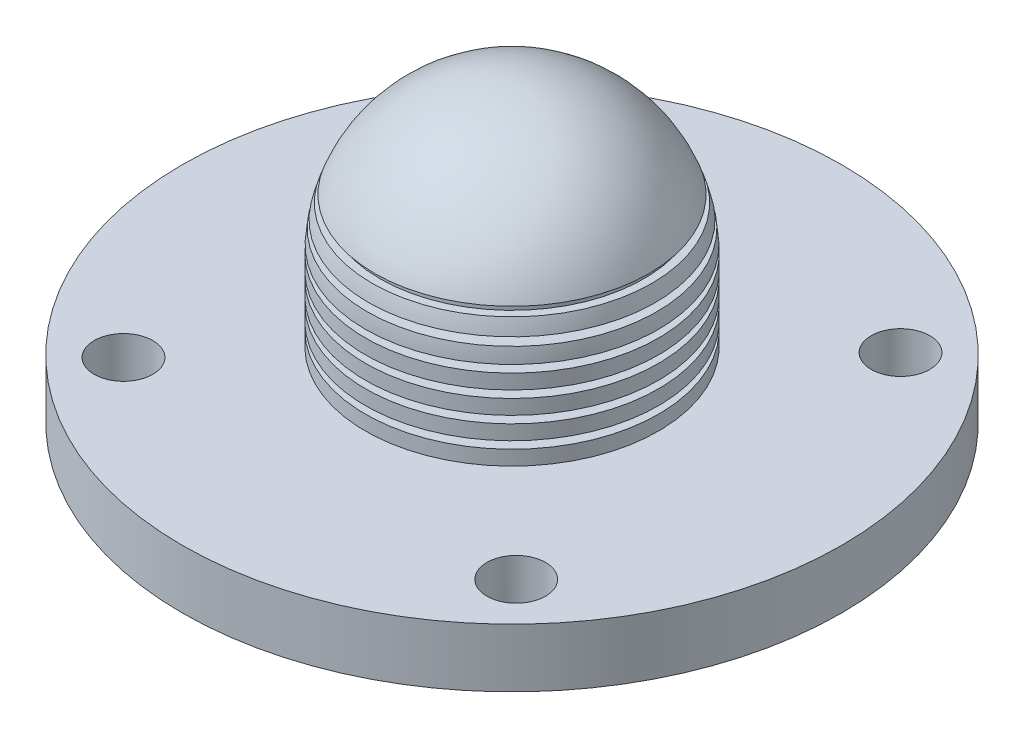
ISO-10303-21;
HEADER;
FILE_DESCRIPTION(('STEP AP214'),'2;1');
FILE_NAME('part.step','',(''),(''),'','','');
FILE_SCHEMA(('AUTOMOTIVE_DESIGN { 1 0 10303 214 1 1 1 1 }'));
ENDSEC;
DATA;
#1=APPLICATION_CONTEXT('core data for automotive mechanical design processes');
#2=APPLICATION_PROTOCOL_DEFINITION('international standard','automotive_design',2000,#1);
#3=PRODUCT_CONTEXT('',#1,'mechanical');
#4=PRODUCT('Part','Part','',(#3));
#5=PRODUCT_RELATED_PRODUCT_CATEGORY('part','',(#4));
#6=PRODUCT_DEFINITION_FORMATION('','',#4);
#7=PRODUCT_DEFINITION_CONTEXT('part definition',#1,'design');
#8=PRODUCT_DEFINITION('design','',#6,#7);
#9=PRODUCT_DEFINITION_SHAPE('','',#8);
#10=(LENGTH_UNIT() NAMED_UNIT(*) SI_UNIT(.MILLI.,.METRE.));
#11=(NAMED_UNIT(*) PLANE_ANGLE_UNIT() SI_UNIT($,.RADIAN.));
#12=(NAMED_UNIT(*) SI_UNIT($,.STERADIAN.) SOLID_ANGLE_UNIT());
#13=UNCERTAINTY_MEASURE_WITH_UNIT(LENGTH_MEASURE(1.E-05),#10,'distance_accuracy_value','');
#14=(GEOMETRIC_REPRESENTATION_CONTEXT(3) GLOBAL_UNCERTAINTY_ASSIGNED_CONTEXT((#13)) GLOBAL_UNIT_ASSIGNED_CONTEXT((#10,
#11,#12)) REPRESENTATION_CONTEXT('',''));
#15=CARTESIAN_POINT('',(0.,0.,0.));
#16=DIRECTION('',(0.,0.,1.));
#17=DIRECTION('',(1.,0.,0.));
#18=AXIS2_PLACEMENT_3D('',#15,#16,#17);
#19=CARTESIAN_POINT('',(0.,4.,0.));
#20=DIRECTION('',(0.,-1.,0.));
#21=DIRECTION('',(0.,0.,-1.));
#22=AXIS2_PLACEMENT_3D('',#19,#20,#21);
#23=CYLINDRICAL_SURFACE('',#22,22.5);
#24=CARTESIAN_POINT('',(0.,4.,0.));
#25=DIRECTION('',(0.,1.,0.));
#26=DIRECTION('',(0.,0.,1.));
#27=AXIS2_PLACEMENT_3D('',#24,#25,#26);
#28=CIRCLE('',#27,22.5);
#29=CARTESIAN_POINT('',(0.,4.,22.5));
#30=VERTEX_POINT('',#29);
#31=EDGE_CURVE('E10',#30,#30,#28,.T.);
#32=ORIENTED_EDGE('',*,*,#31,.F.);
#33=EDGE_LOOP('',(#32));
#34=FACE_BOUND('',#33,.T.);
#35=CARTESIAN_POINT('',(0.,0.,0.));
#36=DIRECTION('',(0.,1.,0.));
#37=DIRECTION('',(0.,0.,1.));
#38=AXIS2_PLACEMENT_3D('',#35,#36,#37);
#39=CIRCLE('',#38,22.5);
#40=CARTESIAN_POINT('',(0.,0.,22.5));
#41=VERTEX_POINT('',#40);
#42=EDGE_CURVE('E52',#41,#41,#39,.T.);
#43=ORIENTED_EDGE('',*,*,#42,.T.);
#44=EDGE_LOOP('',(#43));
#45=FACE_BOUND('',#44,.T.);
#46=ADVANCED_FACE('F43',(#34,#45),#23,.T.);
#47=CARTESIAN_POINT('',(0.,4.,0.));
#48=DIRECTION('',(0.,1.,0.));
#49=DIRECTION('',(0.,0.,1.));
#50=AXIS2_PLACEMENT_3D('',#47,#48,#49);
#51=PLANE('',#50);
#52=CARTESIAN_POINT('',(13.4014866743029,4.,13.1134532034274));
#53=DIRECTION('',(0.,1.,0.));
#54=DIRECTION('',(0.,0.,1.));
#55=AXIS2_PLACEMENT_3D('',#52,#53,#54);
#56=CIRCLE('',#55,1.99999999999997);
#57=CARTESIAN_POINT('',(13.4014866743029,4.,15.1134532034273));
#58=VERTEX_POINT('',#57);
#59=EDGE_CURVE('E58',#58,#58,#56,.T.);
#60=ORIENTED_EDGE('',*,*,#59,.F.);
#61=EDGE_LOOP('',(#60));
#62=FACE_BOUND('',#61,.T.);
#63=CARTESIAN_POINT('',(13.1134532034276,4.,-13.4014866743032));
#64=DIRECTION('',(0.,1.,0.));
#65=DIRECTION('',(0.,0.,1.));
#66=AXIS2_PLACEMENT_3D('',#63,#64,#65);
#67=CIRCLE('',#66,2.00000000000007);
#68=CARTESIAN_POINT('',(13.1134532034276,4.,-11.4014866743031));
#69=VERTEX_POINT('',#68);
#70=EDGE_CURVE('E108',#69,#69,#67,.T.);
#71=ORIENTED_EDGE('',*,*,#70,.F.);
#72=EDGE_LOOP('',(#71));
#73=FACE_BOUND('',#72,.T.);
#74=CARTESIAN_POINT('',(-13.401486674303,4.,-13.1134532034278));
#75=DIRECTION('',(0.,1.,0.));
#76=DIRECTION('',(0.,0.,1.));
#77=AXIS2_PLACEMENT_3D('',#74,#75,#76);
#78=CIRCLE('',#77,2.00000000000002);
#79=CARTESIAN_POINT('',(-13.401486674303,4.,-11.1134532034278));
#80=VERTEX_POINT('',#79);
#81=EDGE_CURVE('E105',#80,#80,#78,.T.);
#82=ORIENTED_EDGE('',*,*,#81,.F.);
#83=EDGE_LOOP('',(#82));
#84=FACE_BOUND('',#83,.T.);
#85=CARTESIAN_POINT('',(-13.1134532034276,4.,13.4014866743027));
#86=DIRECTION('',(0.,1.,0.));
#87=DIRECTION('',(0.,0.,1.));
#88=AXIS2_PLACEMENT_3D('',#85,#86,#87);
#89=CIRCLE('',#88,1.99999999999994);
#90=CARTESIAN_POINT('',(-13.1134532034276,4.,15.4014866743026));
#91=VERTEX_POINT('',#90);
#92=EDGE_CURVE('E101',#91,#91,#89,.T.);
#93=ORIENTED_EDGE('',*,*,#92,.F.);
#94=EDGE_LOOP('',(#93));
#95=FACE_BOUND('',#94,.T.);
#96=ORIENTED_EDGE('',*,*,#31,.T.);
#97=EDGE_LOOP('',(#96));
#98=FACE_BOUND('',#97,.T.);
#99=CARTESIAN_POINT('',(0.,4.,0.));
#100=DIRECTION('',(0.,-1.,0.));
#101=DIRECTION('',(0.,0.,-1.));
#102=AXIS2_PLACEMENT_3D('',#99,#100,#101);
#103=CIRCLE('',#102,9.);
#104=CARTESIAN_POINT('',(0.,4.,-9.));
#105=VERTEX_POINT('',#104);
#106=EDGE_CURVE('E131',#105,#105,#103,.T.);
#107=ORIENTED_EDGE('',*,*,#106,.T.);
#108=EDGE_LOOP('',(#107));
#109=FACE_BOUND('',#108,.T.);
#110=ADVANCED_FACE('F119',(#62,#73,#84,#95,#98,#109),#51,.T.);
#111=CARTESIAN_POINT('',(0.,0.,0.));
#112=DIRECTION('',(0.,1.,0.));
#113=DIRECTION('',(0.,0.,1.));
#114=AXIS2_PLACEMENT_3D('',#111,#112,#113);
#115=PLANE('',#114);
#116=CARTESIAN_POINT('',(13.4014866743029,0.,13.1134532034274));
#117=DIRECTION('',(0.,-1.,0.));
#118=DIRECTION('',(0.,0.,-1.));
#119=AXIS2_PLACEMENT_3D('',#116,#117,#118);
#120=CIRCLE('',#119,1.99999999999997);
#121=CARTESIAN_POINT('',(13.4014866743029,0.,11.1134532034274));
#122=VERTEX_POINT('',#121);
#123=EDGE_CURVE('E82',#122,#122,#120,.T.);
#124=ORIENTED_EDGE('',*,*,#123,.F.);
#125=EDGE_LOOP('',(#124));
#126=FACE_BOUND('',#125,.T.);
#127=CARTESIAN_POINT('',(13.1134532034276,0.,-13.4014866743032));
#128=DIRECTION('',(0.,-1.,0.));
#129=DIRECTION('',(0.,0.,-1.));
#130=AXIS2_PLACEMENT_3D('',#127,#128,#129);
#131=CIRCLE('',#130,2.00000000000007);
#132=CARTESIAN_POINT('',(13.1134532034276,0.,-15.4014866743032));
#133=VERTEX_POINT('',#132);
#134=EDGE_CURVE('E87',#133,#133,#131,.T.);
#135=ORIENTED_EDGE('',*,*,#134,.F.);
#136=EDGE_LOOP('',(#135));
#137=FACE_BOUND('',#136,.T.);
#138=CARTESIAN_POINT('',(-13.401486674303,0.,-13.1134532034278));
#139=DIRECTION('',(0.,-1.,0.));
#140=DIRECTION('',(0.,0.,-1.));
#141=AXIS2_PLACEMENT_3D('',#138,#139,#140);
#142=CIRCLE('',#141,2.00000000000002);
#143=CARTESIAN_POINT('',(-13.401486674303,0.,-15.1134532034279));
#144=VERTEX_POINT('',#143);
#145=EDGE_CURVE('E93',#144,#144,#142,.T.);
#146=ORIENTED_EDGE('',*,*,#145,.F.);
#147=EDGE_LOOP('',(#146));
#148=FACE_BOUND('',#147,.T.);
#149=CARTESIAN_POINT('',(-13.1134532034276,0.,13.4014866743027));
#150=DIRECTION('',(0.,-1.,0.));
#151=DIRECTION('',(0.,0.,-1.));
#152=AXIS2_PLACEMENT_3D('',#149,#150,#151);
#153=CIRCLE('',#152,1.99999999999994);
#154=CARTESIAN_POINT('',(-13.1134532034276,0.,11.4014866743028));
#155=VERTEX_POINT('',#154);
#156=EDGE_CURVE('E97',#155,#155,#153,.T.);
#157=ORIENTED_EDGE('',*,*,#156,.F.);
#158=EDGE_LOOP('',(#157));
#159=FACE_BOUND('',#158,.T.);
#160=ORIENTED_EDGE('',*,*,#42,.F.);
#161=EDGE_LOOP('',(#160));
#162=FACE_BOUND('',#161,.T.);
#163=ADVANCED_FACE('F122',(#126,#137,#148,#159,#162),#115,.F.);
#164=CARTESIAN_POINT('',(-13.1134532034276,10.,13.4014866743027));
#165=DIRECTION('',(0.,-1.,0.));
#166=DIRECTION('',(0.,0.,-1.));
#167=AXIS2_PLACEMENT_3D('',#164,#165,#166);
#168=CYLINDRICAL_SURFACE('',#167,1.99999999999994);
#169=ORIENTED_EDGE('',*,*,#92,.T.);
#170=EDGE_LOOP('',(#169));
#171=FACE_BOUND('',#170,.T.);
#172=ORIENTED_EDGE('',*,*,#156,.T.);
#173=EDGE_LOOP('',(#172));
#174=FACE_BOUND('',#173,.T.);
#175=ADVANCED_FACE('F226',(#171,#174),#168,.F.);
#176=CARTESIAN_POINT('',(-13.401486674303,10.,-13.1134532034278));
#177=DIRECTION('',(0.,-1.,0.));
#178=DIRECTION('',(0.,0.,-1.));
#179=AXIS2_PLACEMENT_3D('',#176,#177,#178);
#180=CYLINDRICAL_SURFACE('',#179,2.00000000000002);
#181=ORIENTED_EDGE('',*,*,#81,.T.);
#182=EDGE_LOOP('',(#181));
#183=FACE_BOUND('',#182,.T.);
#184=ORIENTED_EDGE('',*,*,#145,.T.);
#185=EDGE_LOOP('',(#184));
#186=FACE_BOUND('',#185,.T.);
#187=ADVANCED_FACE('F222',(#183,#186),#180,.F.);
#188=CARTESIAN_POINT('',(13.1134532034276,10.,-13.4014866743032));
#189=DIRECTION('',(0.,-1.,0.));
#190=DIRECTION('',(0.,0.,-1.));
#191=AXIS2_PLACEMENT_3D('',#188,#189,#190);
#192=CYLINDRICAL_SURFACE('',#191,2.00000000000007);
#193=ORIENTED_EDGE('',*,*,#70,.T.);
#194=EDGE_LOOP('',(#193));
#195=FACE_BOUND('',#194,.T.);
#196=ORIENTED_EDGE('',*,*,#134,.T.);
#197=EDGE_LOOP('',(#196));
#198=FACE_BOUND('',#197,.T.);
#199=ADVANCED_FACE('F252',(#195,#198),#192,.F.);
#200=CARTESIAN_POINT('',(13.4014866743029,10.,13.1134532034274));
#201=DIRECTION('',(0.,-1.,0.));
#202=DIRECTION('',(0.,0.,-1.));
#203=AXIS2_PLACEMENT_3D('',#200,#201,#202);
#204=CYLINDRICAL_SURFACE('',#203,1.99999999999997);
#205=ORIENTED_EDGE('',*,*,#59,.T.);
#206=EDGE_LOOP('',(#205));
#207=FACE_BOUND('',#206,.T.);
#208=ORIENTED_EDGE('',*,*,#123,.T.);
#209=EDGE_LOOP('',(#208));
#210=FACE_BOUND('',#209,.T.);
#211=ADVANCED_FACE('F117',(#207,#210),#204,.F.);
#212=CARTESIAN_POINT('',(-10.,4.5,0.));
#213=DIRECTION('',(0.,-1.,0.));
#214=DIRECTION('',(0.,0.,-1.));
#215=AXIS2_PLACEMENT_3D('',#212,#213,#214);
#216=PLANE('',#215);
#217=CARTESIAN_POINT('',(0.,4.5,0.));
#218=DIRECTION('',(0.,-1.,0.));
#219=DIRECTION('',(0.,0.,-1.));
#220=AXIS2_PLACEMENT_3D('',#217,#218,#219);
#221=CIRCLE('',#220,10.);
#222=CARTESIAN_POINT('',(0.,4.5,-10.));
#223=VERTEX_POINT('',#222);
#224=EDGE_CURVE('E68',#223,#223,#221,.T.);
#225=ORIENTED_EDGE('',*,*,#224,.T.);
#226=EDGE_LOOP('',(#225));
#227=FACE_BOUND('',#226,.T.);
#228=CARTESIAN_POINT('',(0.,4.5,0.));
#229=DIRECTION('',(0.,-1.,0.));
#230=DIRECTION('',(0.,0.,-1.));
#231=AXIS2_PLACEMENT_3D('',#228,#229,#230);
#232=CIRCLE('',#231,9.);
#233=CARTESIAN_POINT('',(0.,4.5,-9.));
#234=VERTEX_POINT('',#233);
#235=EDGE_CURVE('E134',#234,#234,#232,.T.);
#236=ORIENTED_EDGE('',*,*,#235,.F.);
#237=EDGE_LOOP('',(#236));
#238=FACE_BOUND('',#237,.T.);
#239=ADVANCED_FACE('F251',(#227,#238),#216,.T.);
#240=CARTESIAN_POINT('',(0.,0.,0.));
#241=DIRECTION('',(0.,-1.,0.));
#242=DIRECTION('',(0.,0.,-1.));
#243=AXIS2_PLACEMENT_3D('',#240,#241,#242);
#244=CYLINDRICAL_SURFACE('',#243,9.);
#245=ORIENTED_EDGE('',*,*,#235,.T.);
#246=EDGE_LOOP('',(#245));
#247=FACE_BOUND('',#246,.T.);
#248=ORIENTED_EDGE('',*,*,#106,.F.);
#249=EDGE_LOOP('',(#248));
#250=FACE_BOUND('',#249,.T.);
#251=ADVANCED_FACE('F242',(#247,#250),#244,.T.);
#252=CARTESIAN_POINT('',(0.,20.,0.));
#253=DIRECTION('',(0.,-1.,0.));
#254=DIRECTION('',(0.,0.,-1.));
#255=AXIS2_PLACEMENT_3D('',#252,#253,#254);
#256=CYLINDRICAL_SURFACE('',#255,10.);
#257=CARTESIAN_POINT('',(0.,5.5,0.));
#258=DIRECTION('',(0.,-1.,0.));
#259=DIRECTION('',(0.,0.,-1.));
#260=AXIS2_PLACEMENT_3D('',#257,#258,#259);
#261=CIRCLE('',#260,10.);
#262=CARTESIAN_POINT('',(0.,5.5,-10.));
#263=VERTEX_POINT('',#262);
#264=EDGE_CURVE('E135',#263,#263,#261,.T.);
#265=ORIENTED_EDGE('',*,*,#264,.T.);
#266=EDGE_LOOP('',(#265));
#267=FACE_BOUND('',#266,.T.);
#268=ORIENTED_EDGE('',*,*,#224,.F.);
#269=EDGE_LOOP('',(#268));
#270=FACE_BOUND('',#269,.T.);
#271=ADVANCED_FACE('F238',(#267,#270),#256,.T.);
#272=CARTESIAN_POINT('',(-9.00000000000001,5.5,0.));
#273=DIRECTION('',(0.,1.,0.));
#274=DIRECTION('',(0.,0.,1.));
#275=AXIS2_PLACEMENT_3D('',#272,#273,#274);
#276=PLANE('',#275);
#277=CARTESIAN_POINT('',(0.,5.5,0.));
#278=DIRECTION('',(0.,-1.,0.));
#279=DIRECTION('',(0.,0.,-1.));
#280=AXIS2_PLACEMENT_3D('',#277,#278,#279);
#281=CIRCLE('',#280,9.00000000000001);
#282=CARTESIAN_POINT('',(0.,5.5,-9.00000000000001));
#283=VERTEX_POINT('',#282);
#284=EDGE_CURVE('E148',#283,#283,#281,.T.);
#285=ORIENTED_EDGE('',*,*,#284,.T.);
#286=EDGE_LOOP('',(#285));
#287=FACE_BOUND('',#286,.T.);
#288=ORIENTED_EDGE('',*,*,#264,.F.);
#289=EDGE_LOOP('',(#288));
#290=FACE_BOUND('',#289,.T.);
#291=ADVANCED_FACE('F241',(#287,#290),#276,.T.);
#292=CARTESIAN_POINT('',(-10.,6.,0.));
#293=DIRECTION('',(0.,-1.,0.));
#294=DIRECTION('',(0.,0.,-1.));
#295=AXIS2_PLACEMENT_3D('',#292,#293,#294);
#296=PLANE('',#295);
#297=CARTESIAN_POINT('',(0.,6.,0.));
#298=DIRECTION('',(0.,-1.,0.));
#299=DIRECTION('',(0.,0.,-1.));
#300=AXIS2_PLACEMENT_3D('',#297,#298,#299);
#301=CIRCLE('',#300,10.);
#302=CARTESIAN_POINT('',(0.,6.,-10.));
#303=VERTEX_POINT('',#302);
#304=EDGE_CURVE('E142',#303,#303,#301,.T.);
#305=ORIENTED_EDGE('',*,*,#304,.T.);
#306=EDGE_LOOP('',(#305));
#307=FACE_BOUND('',#306,.T.);
#308=CARTESIAN_POINT('',(0.,6.,0.));
#309=DIRECTION('',(0.,-1.,0.));
#310=DIRECTION('',(0.,0.,-1.));
#311=AXIS2_PLACEMENT_3D('',#308,#309,#310);
#312=CIRCLE('',#311,9.00000000000001);
#313=CARTESIAN_POINT('',(0.,6.,-9.00000000000001));
#314=VERTEX_POINT('',#313);
#315=EDGE_CURVE('E152',#314,#314,#312,.T.);
#316=ORIENTED_EDGE('',*,*,#315,.F.);
#317=EDGE_LOOP('',(#316));
#318=FACE_BOUND('',#317,.T.);
#319=ADVANCED_FACE('F323',(#307,#318),#296,.T.);
#320=CARTESIAN_POINT('',(0.,0.,0.));
#321=DIRECTION('',(0.,-1.,0.));
#322=DIRECTION('',(0.,0.,-1.));
#323=AXIS2_PLACEMENT_3D('',#320,#321,#322);
#324=CYLINDRICAL_SURFACE('',#323,9.00000000000001);
#325=ORIENTED_EDGE('',*,*,#315,.T.);
#326=EDGE_LOOP('',(#325));
#327=FACE_BOUND('',#326,.T.);
#328=ORIENTED_EDGE('',*,*,#284,.F.);
#329=EDGE_LOOP('',(#328));
#330=FACE_BOUND('',#329,.T.);
#331=ADVANCED_FACE('F327',(#327,#330),#324,.T.);
#332=CARTESIAN_POINT('',(0.,7.,0.));
#333=DIRECTION('',(0.,-1.,0.));
#334=DIRECTION('',(0.,0.,-1.));
#335=AXIS2_PLACEMENT_3D('',#332,#333,#334);
#336=CIRCLE('',#335,10.);
#337=CARTESIAN_POINT('',(0.,7.,-10.));
#338=VERTEX_POINT('',#337);
#339=EDGE_CURVE('E153',#338,#338,#336,.T.);
#340=ORIENTED_EDGE('',*,*,#339,.T.);
#341=EDGE_LOOP('',(#340));
#342=FACE_BOUND('',#341,.T.);
#343=ORIENTED_EDGE('',*,*,#304,.F.);
#344=EDGE_LOOP('',(#343));
#345=FACE_BOUND('',#344,.T.);
#346=ADVANCED_FACE('F244',(#342,#345),#256,.T.);
#347=CARTESIAN_POINT('',(-9.00000000000001,7.,0.));
#348=DIRECTION('',(0.,1.,0.));
#349=DIRECTION('',(0.,0.,1.));
#350=AXIS2_PLACEMENT_3D('',#347,#348,#349);
#351=PLANE('',#350);
#352=CARTESIAN_POINT('',(0.,7.,0.));
#353=DIRECTION('',(0.,-1.,0.));
#354=DIRECTION('',(0.,0.,-1.));
#355=AXIS2_PLACEMENT_3D('',#352,#353,#354);
#356=CIRCLE('',#355,9.00000000000001);
#357=CARTESIAN_POINT('',(0.,7.,-9.00000000000001));
#358=VERTEX_POINT('',#357);
#359=EDGE_CURVE('E160',#358,#358,#356,.T.);
#360=ORIENTED_EDGE('',*,*,#359,.T.);
#361=EDGE_LOOP('',(#360));
#362=FACE_BOUND('',#361,.T.);
#363=ORIENTED_EDGE('',*,*,#339,.F.);
#364=EDGE_LOOP('',(#363));
#365=FACE_BOUND('',#364,.T.);
#366=ADVANCED_FACE('F309',(#362,#365),#351,.T.);
#367=CARTESIAN_POINT('',(-10.,7.5,0.));
#368=DIRECTION('',(0.,-1.,0.));
#369=DIRECTION('',(0.,0.,-1.));
#370=AXIS2_PLACEMENT_3D('',#367,#368,#369);
#371=PLANE('',#370);
#372=CARTESIAN_POINT('',(0.,7.5,0.));
#373=DIRECTION('',(0.,-1.,0.));
#374=DIRECTION('',(0.,0.,-1.));
#375=AXIS2_PLACEMENT_3D('',#372,#373,#374);
#376=CIRCLE('',#375,10.);
#377=CARTESIAN_POINT('',(0.,7.5,-10.));
#378=VERTEX_POINT('',#377);
#379=EDGE_CURVE('E169',#378,#378,#376,.T.);
#380=ORIENTED_EDGE('',*,*,#379,.T.);
#381=EDGE_LOOP('',(#380));
#382=FACE_BOUND('',#381,.T.);
#383=CARTESIAN_POINT('',(0.,7.5,0.));
#384=DIRECTION('',(0.,-1.,0.));
#385=DIRECTION('',(0.,0.,-1.));
#386=AXIS2_PLACEMENT_3D('',#383,#384,#385);
#387=CIRCLE('',#386,9.00000000000001);
#388=CARTESIAN_POINT('',(0.,7.5,-9.00000000000001));
#389=VERTEX_POINT('',#388);
#390=EDGE_CURVE('E164',#389,#389,#387,.T.);
#391=ORIENTED_EDGE('',*,*,#390,.F.);
#392=EDGE_LOOP('',(#391));
#393=FACE_BOUND('',#392,.T.);
#394=ADVANCED_FACE('F312',(#382,#393),#371,.T.);
#395=CARTESIAN_POINT('',(0.,0.,0.));
#396=DIRECTION('',(0.,-1.,0.));
#397=DIRECTION('',(0.,0.,-1.));
#398=AXIS2_PLACEMENT_3D('',#395,#396,#397);
#399=CYLINDRICAL_SURFACE('',#398,9.00000000000001);
#400=ORIENTED_EDGE('',*,*,#390,.T.);
#401=EDGE_LOOP('',(#400));
#402=FACE_BOUND('',#401,.T.);
#403=ORIENTED_EDGE('',*,*,#359,.F.);
#404=EDGE_LOOP('',(#403));
#405=FACE_BOUND('',#404,.T.);
#406=ADVANCED_FACE('F316',(#402,#405),#399,.T.);
#407=CARTESIAN_POINT('',(0.,8.5,0.));
#408=DIRECTION('',(0.,-1.,0.));
#409=DIRECTION('',(0.,0.,-1.));
#410=AXIS2_PLACEMENT_3D('',#407,#408,#409);
#411=CIRCLE('',#410,10.);
#412=CARTESIAN_POINT('',(0.,8.5,-10.));
#413=VERTEX_POINT('',#412);
#414=EDGE_CURVE('E165',#413,#413,#411,.T.);
#415=ORIENTED_EDGE('',*,*,#414,.T.);
#416=EDGE_LOOP('',(#415));
#417=FACE_BOUND('',#416,.T.);
#418=ORIENTED_EDGE('',*,*,#379,.F.);
#419=EDGE_LOOP('',(#418));
#420=FACE_BOUND('',#419,.T.);
#421=ADVANCED_FACE('F300',(#417,#420),#256,.T.);
#422=CARTESIAN_POINT('',(-9.00000000000002,8.5,0.));
#423=DIRECTION('',(0.,1.,0.));
#424=DIRECTION('',(0.,0.,1.));
#425=AXIS2_PLACEMENT_3D('',#422,#423,#424);
#426=PLANE('',#425);
#427=CARTESIAN_POINT('',(0.,8.5,0.));
#428=DIRECTION('',(0.,-1.,0.));
#429=DIRECTION('',(0.,0.,-1.));
#430=AXIS2_PLACEMENT_3D('',#427,#428,#429);
#431=CIRCLE('',#430,9.00000000000002);
#432=CARTESIAN_POINT('',(0.,8.5,-9.00000000000002));
#433=VERTEX_POINT('',#432);
#434=EDGE_CURVE('E176',#433,#433,#431,.T.);
#435=ORIENTED_EDGE('',*,*,#434,.T.);
#436=EDGE_LOOP('',(#435));
#437=FACE_BOUND('',#436,.T.);
#438=ORIENTED_EDGE('',*,*,#414,.F.);
#439=EDGE_LOOP('',(#438));
#440=FACE_BOUND('',#439,.T.);
#441=ADVANCED_FACE('F296',(#437,#440),#426,.T.);
#442=CARTESIAN_POINT('',(-10.,9.,0.));
#443=DIRECTION('',(0.,-1.,0.));
#444=DIRECTION('',(0.,0.,-1.));
#445=AXIS2_PLACEMENT_3D('',#442,#443,#444);
#446=PLANE('',#445);
#447=CARTESIAN_POINT('',(0.,9.,0.));
#448=DIRECTION('',(0.,-1.,0.));
#449=DIRECTION('',(0.,0.,-1.));
#450=AXIS2_PLACEMENT_3D('',#447,#448,#449);
#451=CIRCLE('',#450,10.);
#452=CARTESIAN_POINT('',(0.,9.,-10.));
#453=VERTEX_POINT('',#452);
#454=EDGE_CURVE('E185',#453,#453,#451,.T.);
#455=ORIENTED_EDGE('',*,*,#454,.T.);
#456=EDGE_LOOP('',(#455));
#457=FACE_BOUND('',#456,.T.);
#458=CARTESIAN_POINT('',(0.,9.,0.));
#459=DIRECTION('',(0.,-1.,0.));
#460=DIRECTION('',(0.,0.,-1.));
#461=AXIS2_PLACEMENT_3D('',#458,#459,#460);
#462=CIRCLE('',#461,9.00000000000002);
#463=CARTESIAN_POINT('',(0.,9.,-9.00000000000002));
#464=VERTEX_POINT('',#463);
#465=EDGE_CURVE('E180',#464,#464,#462,.T.);
#466=ORIENTED_EDGE('',*,*,#465,.F.);
#467=EDGE_LOOP('',(#466));
#468=FACE_BOUND('',#467,.T.);
#469=ADVANCED_FACE('F299',(#457,#468),#446,.T.);
#470=CARTESIAN_POINT('',(0.,0.,0.));
#471=DIRECTION('',(0.,-1.,0.));
#472=DIRECTION('',(0.,0.,-1.));
#473=AXIS2_PLACEMENT_3D('',#470,#471,#472);
#474=CYLINDRICAL_SURFACE('',#473,9.00000000000002);
#475=ORIENTED_EDGE('',*,*,#465,.T.);
#476=EDGE_LOOP('',(#475));
#477=FACE_BOUND('',#476,.T.);
#478=ORIENTED_EDGE('',*,*,#434,.F.);
#479=EDGE_LOOP('',(#478));
#480=FACE_BOUND('',#479,.T.);
#481=ADVANCED_FACE('F304',(#477,#480),#474,.T.);
#482=CARTESIAN_POINT('',(0.,10.,0.));
#483=DIRECTION('',(0.,-1.,0.));
#484=DIRECTION('',(0.,0.,-1.));
#485=AXIS2_PLACEMENT_3D('',#482,#483,#484);
#486=CIRCLE('',#485,10.);
#487=CARTESIAN_POINT('',(0.,10.,-10.));
#488=VERTEX_POINT('',#487);
#489=EDGE_CURVE('E181',#488,#488,#486,.T.);
#490=ORIENTED_EDGE('',*,*,#489,.T.);
#491=EDGE_LOOP('',(#490));
#492=FACE_BOUND('',#491,.T.);
#493=ORIENTED_EDGE('',*,*,#454,.F.);
#494=EDGE_LOOP('',(#493));
#495=FACE_BOUND('',#494,.T.);
#496=ADVANCED_FACE('F245',(#492,#495),#256,.T.);
#497=CARTESIAN_POINT('',(-9.00000000000002,10.,0.));
#498=DIRECTION('',(0.,1.,0.));
#499=DIRECTION('',(0.,0.,1.));
#500=AXIS2_PLACEMENT_3D('',#497,#498,#499);
#501=PLANE('',#500);
#502=CARTESIAN_POINT('',(0.,10.,0.));
#503=DIRECTION('',(0.,-1.,0.));
#504=DIRECTION('',(0.,0.,-1.));
#505=AXIS2_PLACEMENT_3D('',#502,#503,#504);
#506=CIRCLE('',#505,9.00000000000002);
#507=CARTESIAN_POINT('',(0.,10.,-9.00000000000002));
#508=VERTEX_POINT('',#507);
#509=EDGE_CURVE('E192',#508,#508,#506,.T.);
#510=ORIENTED_EDGE('',*,*,#509,.T.);
#511=EDGE_LOOP('',(#510));
#512=FACE_BOUND('',#511,.T.);
#513=ORIENTED_EDGE('',*,*,#489,.F.);
#514=EDGE_LOOP('',(#513));
#515=FACE_BOUND('',#514,.T.);
#516=ADVANCED_FACE('F284',(#512,#515),#501,.T.);
#517=CARTESIAN_POINT('',(-10.,10.5,0.));
#518=DIRECTION('',(0.,-1.,0.));
#519=DIRECTION('',(0.,0.,-1.));
#520=AXIS2_PLACEMENT_3D('',#517,#518,#519);
#521=PLANE('',#520);
#522=CARTESIAN_POINT('',(0.,10.5,0.));
#523=DIRECTION('',(0.,-1.,0.));
#524=DIRECTION('',(0.,0.,-1.));
#525=AXIS2_PLACEMENT_3D('',#522,#523,#524);
#526=CIRCLE('',#525,9.98749217771909);
#527=CARTESIAN_POINT('',(0.,10.5,9.98749217771909));
#528=VERTEX_POINT('',#527);
#529=EDGE_CURVE('E47',#528,#528,#526,.F.);
#530=ORIENTED_EDGE('',*,*,#529,.F.);
#531=EDGE_LOOP('',(#530));
#532=FACE_BOUND('',#531,.T.);
#533=CARTESIAN_POINT('',(0.,10.5,0.));
#534=DIRECTION('',(0.,-1.,0.));
#535=DIRECTION('',(0.,0.,-1.));
#536=AXIS2_PLACEMENT_3D('',#533,#534,#535);
#537=CIRCLE('',#536,9.00000000000002);
#538=CARTESIAN_POINT('',(0.,10.5,-9.00000000000002));
#539=VERTEX_POINT('',#538);
#540=EDGE_CURVE('E196',#539,#539,#537,.T.);
#541=ORIENTED_EDGE('',*,*,#540,.F.);
#542=EDGE_LOOP('',(#541));
#543=FACE_BOUND('',#542,.T.);
#544=ADVANCED_FACE('F287',(#532,#543),#521,.T.);
#545=CARTESIAN_POINT('',(0.,0.,0.));
#546=DIRECTION('',(0.,-1.,0.));
#547=DIRECTION('',(0.,0.,-1.));
#548=AXIS2_PLACEMENT_3D('',#545,#546,#547);
#549=CYLINDRICAL_SURFACE('',#548,9.00000000000002);
#550=ORIENTED_EDGE('',*,*,#540,.T.);
#551=EDGE_LOOP('',(#550));
#552=FACE_BOUND('',#551,.T.);
#553=ORIENTED_EDGE('',*,*,#509,.F.);
#554=EDGE_LOOP('',(#553));
#555=FACE_BOUND('',#554,.T.);
#556=ADVANCED_FACE('F291',(#552,#555),#549,.T.);
#557=CARTESIAN_POINT('',(0.,10.,0.));
#558=DIRECTION('',(0.,1.,0.));
#559=DIRECTION('',(0.,0.,1.));
#560=AXIS2_PLACEMENT_3D('',#557,#558,#559);
#561=SPHERICAL_SURFACE('',#560,10.);
#562=CARTESIAN_POINT('',(0.,11.5,0.));
#563=DIRECTION('',(0.,1.,0.));
#564=DIRECTION('',(0.,0.,1.));
#565=AXIS2_PLACEMENT_3D('',#562,#563,#564);
#566=CIRCLE('',#565,9.88685996664259);
#567=CARTESIAN_POINT('',(0.,11.5,9.88685996664259));
#568=VERTEX_POINT('',#567);
#569=EDGE_CURVE('E75',#568,#568,#566,.F.);
#570=CARTESIAN_POINT('',(0.,11.5,9.88685996664259));
#571=CARTESIAN_POINT('',(0.,11.4896448101991,9.88843102007485));
#572=CARTESIAN_POINT('',(0.,11.4792871521726,9.88998580483787));
#573=CARTESIAN_POINT('',(0.,11.4585670019654,9.89306282192879));
#574=CARTESIAN_POINT('',(0.,11.4482045097847,9.8945850542567));
#575=CARTESIAN_POINT('',(0.,11.4274747935663,9.89759695138075));
#576=CARTESIAN_POINT('',(0.,11.4171075695284,9.89908661617689));
#577=CARTESIAN_POINT('',(0.,11.3963684919522,9.90203336354839));
#578=CARTESIAN_POINT('',(0.,11.3859966384137,9.90349044612376));
#579=CARTESIAN_POINT('',(0.,11.3652484042349,9.90637201466332));
#580=CARTESIAN_POINT('',(0.,11.3548720235946,9.90779650062752));
#581=CARTESIAN_POINT('',(0.,11.3341148376566,9.91061286188234));
#582=CARTESIAN_POINT('',(0.,11.3237340323588,9.91200473717297));
#583=CARTESIAN_POINT('',(0.,11.3029680995936,9.91475586333856));
#584=CARTESIAN_POINT('',(0.,11.2925829721263,9.91611511421353));
#585=CARTESIAN_POINT('',(0.,11.2718084975525,9.91880097812825));
#586=CARTESIAN_POINT('',(0.,11.2614191504461,9.920127591168));
#587=CARTESIAN_POINT('',(0.,11.2406363391664,9.92274816631484));
#588=CARTESIAN_POINT('',(0.,11.2302428749932,9.92404212842193));
#589=CARTESIAN_POINT('',(0.,11.2094519321928,9.92659738892839));
#590=CARTESIAN_POINT('',(0.,11.1990544535656,9.92785868732775));
#591=CARTESIAN_POINT('',(0.,11.1782555845098,9.93034860796619));
#592=CARTESIAN_POINT('',(0.,11.1678541940812,9.93157723020526));
#593=CARTESIAN_POINT('',(0.,11.1470476041137,9.93400178639312));
#594=CARTESIAN_POINT('',(0.,11.1366424045747,9.93519772034192));
#595=CARTESIAN_POINT('',(0.,11.1158282991153,9.93755688814198));
#596=CARTESIAN_POINT('',(0.,11.1054193931948,9.93872012199325));
#597=CARTESIAN_POINT('',(0.,11.0845979777375,9.94101387811386));
#598=CARTESIAN_POINT('',(0.,11.0741854682008,9.9421444003832));
#599=CARTESIAN_POINT('',(0.,11.0533569483119,9.9443727221785));
#600=CARTESIAN_POINT('',(0.,11.0429409379597,9.94547052170446));
#601=CARTESIAN_POINT('',(0.,11.0221055192756,9.94763338717461));
#602=CARTESIAN_POINT('',(0.,11.0116861109436,9.94869845311881));
#603=CARTESIAN_POINT('',(0.,10.9908439991687,9.95079584091022));
#604=CARTESIAN_POINT('',(0.,10.9804212957258,9.95182816275744));
#605=CARTESIAN_POINT('',(0.,10.9595726966306,9.95386005216296));
#606=CARTESIAN_POINT('',(0.,10.9491468009784,9.95485961972127));
#607=CARTESIAN_POINT('',(0.,10.9282919203977,9.95682599068042));
#608=CARTESIAN_POINT('',(0.,10.9178629354692,9.95779279408126));
#609=CARTESIAN_POINT('',(0.,10.8970019792995,9.95969362718038));
#610=CARTESIAN_POINT('',(0.,10.8865700080583,9.96062765687867));
#611=CARTESIAN_POINT('',(0.,10.8657031822562,9.96246293335118));
#612=CARTESIAN_POINT('',(0.,10.8552683276953,9.96336418012541));
#613=CARTESIAN_POINT('',(0.,10.8343958382754,9.96513388185194));
#614=CARTESIAN_POINT('',(0.,10.8239582034163,9.96600233680424));
#615=CARTESIAN_POINT('',(0.,10.8030802564491,9.96770644631283));
#616=CARTESIAN_POINT('',(0.,10.7926399443408,9.96854210086912));
#617=CARTESIAN_POINT('',(0.,10.7717567459505,9.97018060133539));
#618=CARTESIAN_POINT('',(0.,10.7613138596685,9.97098344724538));
#619=CARTESIAN_POINT('',(0.,10.7404256160314,9.9725563224927));
#620=CARTESIAN_POINT('',(0.,10.7299802586764,9.97332635183003));
#621=CARTESIAN_POINT('',(0.,10.7090871760185,9.97483358632969));
#622=CARTESIAN_POINT('',(0.,10.6986394507157,9.97557079149203));
#623=CARTESIAN_POINT('',(0.,10.6777417353108,9.97701237036329));
#624=CARTESIAN_POINT('',(0.,10.6672917452088,9.97771674407223));
#625=CARTESIAN_POINT('',(0.,10.6463896033764,9.97909265308291));
#626=CARTESIAN_POINT('',(0.,10.6359374516461,9.97976418838464));
#627=CARTESIAN_POINT('',(0.,10.6150310897494,9.98107441394965));
#628=CARTESIAN_POINT('',(0.,10.6045768795831,9.98171310421291));
#629=CARTESIAN_POINT('',(0.,10.5836665040272,9.98295763340022));
#630=CARTESIAN_POINT('',(0.,10.5732103386377,9.98356347232427));
#631=CARTESIAN_POINT('',(0.,10.5522961558664,9.98474229283341));
#632=CARTESIAN_POINT('',(0.,10.5418381384846,9.98531527441851));
#633=CARTESIAN_POINT('',(0.,10.5209203549826,9.98642837466139));
#634=CARTESIAN_POINT('',(0.,10.5104605888625,9.98696849331917));
#635=CARTESIAN_POINT('',(0.,10.5,9.98749217771909));
#636=B_SPLINE_CURVE_WITH_KNOTS('',3,(#570,#571,#572,#573,#574,#575,#576,#577,#578,#579,#580,
#581,#582,#583,#584,#585,#586,#587,#588,#589,#590,#591,#592,#593,#594,#595,#596,#597,#598,#599,
#600,#601,#602,#603,#604,#605,#606,#607,#608,#609,#610,#611,#612,#613,#614,#615,#616,#617,#618,
#619,#620,#621,#622,#623,#624,#625,#626,#627,#628,#629,#630,#631,#632,#633,#634,#635),
.UNSPECIFIED.,.F.,.F.,(4,2,2,2,2,2,2,2,2,2,2,2,2,2,2,2,2,2,2,2,2,2,2,2,2,2,2,2,2,2,2,2,4),(0.,
0.0314210545652861,0.0628421091305746,0.0942631636958618,0.125684218261148,0.157105272826436,
0.188526327391725,0.219947381957012,0.251368436522299,0.282789491087586,0.314210545652874,
0.345631600218161,0.377052654783449,0.408473709348736,0.439894763914024,0.47131581847931,
0.502736873044597,0.534157927609886,0.565578982175173,0.59700003674046,0.628421091305747,
0.659842145871036,0.691263200436323,0.722684255001611,0.754105309566898,0.785526364132185,
0.816947418697473,0.848368473262761,0.879789527828048,0.911210582393335,0.942631636958623,
0.974052691523909,1.0054737460892),.UNSPECIFIED.);
#637=EDGE_CURVE('BSEAM45',#568,#528,#636,.T.);
#638=ORIENTED_EDGE('',*,*,#569,.T.);
#639=ORIENTED_EDGE('',*,*,#529,.T.);
#640=ORIENTED_EDGE('',*,*,#637,.T.);
#641=ORIENTED_EDGE('',*,*,#637,.F.);
#642=EDGE_LOOP('',(#638,#640,#639,#641));
#643=FACE_BOUND('',#642,.T.);
#644=ADVANCED_FACE('F45',(#643),#561,.T.);
#645=CARTESIAN_POINT('',(-9.00000000000003,11.5,0.));
#646=DIRECTION('',(0.,1.,0.));
#647=DIRECTION('',(0.,0.,1.));
#648=AXIS2_PLACEMENT_3D('',#645,#646,#647);
#649=PLANE('',#648);
#650=ORIENTED_EDGE('',*,*,#569,.F.);
#651=EDGE_LOOP('',(#650));
#652=FACE_BOUND('',#651,.T.);
#653=CARTESIAN_POINT('',(0.,11.5,0.));
#654=DIRECTION('',(0.,-1.,0.));
#655=DIRECTION('',(0.,0.,-1.));
#656=AXIS2_PLACEMENT_3D('',#653,#654,#655);
#657=CIRCLE('',#656,9.00000000000003);
#658=CARTESIAN_POINT('',(0.,11.5,-9.00000000000003));
#659=VERTEX_POINT('',#658);
#660=EDGE_CURVE('E204',#659,#659,#657,.T.);
#661=ORIENTED_EDGE('',*,*,#660,.T.);
#662=EDGE_LOOP('',(#661));
#663=FACE_BOUND('',#662,.T.);
#664=ADVANCED_FACE('F272',(#652,#663),#649,.T.);
#665=CARTESIAN_POINT('',(-10.,12.,0.));
#666=DIRECTION('',(0.,-1.,0.));
#667=DIRECTION('',(0.,0.,-1.));
#668=AXIS2_PLACEMENT_3D('',#665,#666,#667);
#669=PLANE('',#668);
#670=CARTESIAN_POINT('',(0.,12.,0.));
#671=DIRECTION('',(0.,-1.,0.));
#672=DIRECTION('',(0.,0.,-1.));
#673=AXIS2_PLACEMENT_3D('',#670,#671,#672);
#674=CIRCLE('',#673,9.79795897113271);
#675=CARTESIAN_POINT('',(0.,12.,9.79795897113271));
#676=VERTEX_POINT('',#675);
#677=EDGE_CURVE('E72',#676,#676,#674,.F.);
#678=ORIENTED_EDGE('',*,*,#677,.F.);
#679=EDGE_LOOP('',(#678));
#680=FACE_BOUND('',#679,.T.);
#681=CARTESIAN_POINT('',(0.,12.,0.));
#682=DIRECTION('',(0.,-1.,0.));
#683=DIRECTION('',(0.,0.,-1.));
#684=AXIS2_PLACEMENT_3D('',#681,#682,#683);
#685=CIRCLE('',#684,9.00000000000003);
#686=CARTESIAN_POINT('',(0.,12.,-9.00000000000003));
#687=VERTEX_POINT('',#686);
#688=EDGE_CURVE('E197',#687,#687,#685,.T.);
#689=ORIENTED_EDGE('',*,*,#688,.F.);
#690=EDGE_LOOP('',(#689));
#691=FACE_BOUND('',#690,.T.);
#692=ADVANCED_FACE('F275',(#680,#691),#669,.T.);
#693=CARTESIAN_POINT('',(0.,0.,0.));
#694=DIRECTION('',(0.,-1.,0.));
#695=DIRECTION('',(0.,0.,-1.));
#696=AXIS2_PLACEMENT_3D('',#693,#694,#695);
#697=CYLINDRICAL_SURFACE('',#696,9.00000000000003);
#698=ORIENTED_EDGE('',*,*,#688,.T.);
#699=EDGE_LOOP('',(#698));
#700=FACE_BOUND('',#699,.T.);
#701=ORIENTED_EDGE('',*,*,#660,.F.);
#702=EDGE_LOOP('',(#701));
#703=FACE_BOUND('',#702,.T.);
#704=ADVANCED_FACE('F279',(#700,#703),#697,.T.);
#705=CARTESIAN_POINT('',(0.,13.,0.));
#706=DIRECTION('',(0.,1.,0.));
#707=DIRECTION('',(0.,0.,1.));
#708=AXIS2_PLACEMENT_3D('',#705,#706,#707);
#709=CIRCLE('',#708,9.53939201416946);
#710=CARTESIAN_POINT('',(0.,13.,9.53939201416946));
#711=VERTEX_POINT('',#710);
#712=EDGE_CURVE('E67',#711,#711,#709,.F.);
#713=CARTESIAN_POINT('',(0.,13.,9.53939201416946));
#714=CARTESIAN_POINT('',(0.,12.9897317653431,9.54262122464489));
#715=CARTESIAN_POINT('',(0.,12.9794583167483,9.5458338558531));
#716=CARTESIAN_POINT('',(0.,12.9589010988971,9.5522259265074));
#717=CARTESIAN_POINT('',(0.,12.9486173296407,9.55540536595348));
#718=CARTESIAN_POINT('',(0.,12.9280395776804,9.56173101985588));
#719=CARTESIAN_POINT('',(0.,12.9177455949765,9.56487723431218));
#720=CARTESIAN_POINT('',(0.,12.8971475234711,9.57113640544652));
#721=CARTESIAN_POINT('',(0.,12.8868434346694,9.57424936212457));
#722=CARTESIAN_POINT('',(0.,12.8662252584156,9.58044198523588));
#723=CARTESIAN_POINT('',(0.,12.8559111709634,9.58352165166916));
#724=CARTESIAN_POINT('',(0.,12.835273104962,9.58964766217823));
#725=CARTESIAN_POINT('',(0.,12.8249491264129,9.59269400625402));
#726=CARTESIAN_POINT('',(0.,12.8042913858738,9.59875334028112));
#727=CARTESIAN_POINT('',(0.,12.7939576238838,9.60176633023241));
#728=CARTESIAN_POINT('',(0.,12.7732804242215,9.60775892459179));
#729=CARTESIAN_POINT('',(0.,12.7629369865491,9.61073852899986));
#730=CARTESIAN_POINT('',(0.,12.742240543381,9.61666432120207));
#731=CARTESIAN_POINT('',(0.,12.7318875378853,9.6196105089962));
#732=CARTESIAN_POINT('',(0.,12.7111720670297,9.6254694372483));
#733=CARTESIAN_POINT('',(0.,12.7008096016698,9.62838217770627));
#734=CARTESIAN_POINT('',(0.,12.6800753191432,9.63417418091259));
#735=CARTESIAN_POINT('',(0.,12.6697035019766,9.63705344366094));
#736=CARTESIAN_POINT('',(0.,12.6489506239918,9.64277846142368));
#737=CARTESIAN_POINT('',(0.,12.6385695631737,9.64562421643807));
#738=CARTESIAN_POINT('',(0.,12.6177983061375,9.65128218905794));
#739=CARTESIAN_POINT('',(0.,12.6074081099194,9.65409440666343));
#740=CARTESIAN_POINT('',(0.,12.5866186904299,9.65968527514028));
#741=CARTESIAN_POINT('',(0.,12.5762194671586,9.66246392601164));
#742=CARTESIAN_POINT('',(0.,12.5554121020037,9.66798763204506));
#743=CARTESIAN_POINT('',(0.,12.5450039601201,9.67073268720712));
#744=CARTESIAN_POINT('',(0.,12.5241788662746,9.67618917319706));
#745=CARTESIAN_POINT('',(0.,12.5137619143127,9.67890060402494));
#746=CARTESIAN_POINT('',(0.,12.4929193089362,9.68428981307231));
#747=CARTESIAN_POINT('',(0.,12.4824936555218,9.68696759129179));
#748=CARTESIAN_POINT('',(0.,12.4616337559568,9.69228946719903));
#749=CARTESIAN_POINT('',(0.,12.4511995098063,9.6949335648868));
#750=CARTESIAN_POINT('',(0.,12.4303225335754,9.70018805215852));
#751=CARTESIAN_POINT('',(0.,12.419879803495,9.70279844174247));
#752=CARTESIAN_POINT('',(0.,12.398985968299,9.70798548558596));
#753=CARTESIAN_POINT('',(0.,12.3885348631834,9.7105621398455));
#754=CARTESIAN_POINT('',(0.,12.3676243868987,9.71568168617137));
#755=CARTESIAN_POINT('',(0.,12.3571650157297,9.71822457823769));
#756=CARTESIAN_POINT('',(0.,12.3362381164066,9.72327657366036));
#757=CARTESIAN_POINT('',(0.,12.3257705882524,9.72578567701672));
#758=CARTESIAN_POINT('',(0.,12.304827484112,9.73077006885505));
#759=CARTESIAN_POINT('',(0.,12.2943519081258,9.73324535733703));
#760=CARTESIAN_POINT('',(0.,12.2733928175585,9.73816209361483));
#761=CARTESIAN_POINT('',(0.,12.2629093029774,9.74060354141064));
#762=CARTESIAN_POINT('',(0.,12.2419344445402,9.74545257085721));
#763=CARTESIAN_POINT('',(0.,12.2314431006841,9.74786015250795));
#764=CARTESIAN_POINT('',(0.,12.2104526930985,9.75264142455862));
#765=CARTESIAN_POINT('',(0.,12.199953629369,9.75501511495856));
#766=CARTESIAN_POINT('',(0.,12.1789478915185,9.75972857975517));
#767=CARTESIAN_POINT('',(0.,12.1684412173975,9.76206835415185));
#768=CARTESIAN_POINT('',(0.,12.1474203683256,9.76671396254366));
#769=CARTESIAN_POINT('',(0.,12.1369061933747,9.76901979653879));
#770=CARTESIAN_POINT('',(0.,12.1158704522822,9.7735975000813));
#771=CARTESIAN_POINT('',(0.,12.1053488861407,9.77586936962869));
#772=CARTESIAN_POINT('',(0.,12.0842984723847,9.78037912059052));
#773=CARTESIAN_POINT('',(0.,12.0737696247704,9.78261700200496));
#774=CARTESIAN_POINT('',(0.,12.0527047578572,9.78705875334465));
#775=CARTESIAN_POINT('',(0.,12.0421687385585,9.7892626232699));
#776=CARTESIAN_POINT('',(0.,12.0210896381595,9.7936363287247));
#777=CARTESIAN_POINT('',(0.,12.0105465570594,9.79580616425425));
#778=CARTESIAN_POINT('',(0.,12.,9.79795897113271));
#779=B_SPLINE_CURVE_WITH_KNOTS('',3,(#713,#714,#715,#716,#717,#718,#719,#720,#721,#722,#723,
#724,#725,#726,#727,#728,#729,#730,#731,#732,#733,#734,#735,#736,#737,#738,#739,#740,#741,#742,
#743,#744,#745,#746,#747,#748,#749,#750,#751,#752,#753,#754,#755,#756,#757,#758,#759,#760,#761,
#762,#763,#764,#765,#766,#767,#768,#769,#770,#771,#772,#773,#774,#775,#776,#777,#778),
.UNSPECIFIED.,.F.,.F.,(4,2,2,2,2,2,2,2,2,2,2,2,2,2,2,2,2,2,2,2,2,2,2,2,2,2,2,2,2,2,2,2,4),(0.,
0.0322920901021865,0.0645841802043721,0.0968762703065567,0.129168360408742,0.161460450510926,
0.193752540613113,0.226044630715298,0.258336720817481,0.290628810919666,0.322920901021853,
0.355212991124038,0.387505081226222,0.419797171328407,0.452089261430593,0.484381351532779,
0.516673441634963,0.548965531737149,0.581257621839333,0.613549711941519,0.645841802043703,
0.678133892145889,0.710425982248075,0.742718072350259,0.775010162452445,0.80730225255463,
0.839594342656815,0.871886432759,0.904178522861185,0.93647061296337,0.968762703065555,
1.00105479316774,1.03334688326993),.UNSPECIFIED.);
#780=EDGE_CURVE('BSEAM262',#711,#676,#779,.T.);
#781=ORIENTED_EDGE('',*,*,#712,.T.);
#782=ORIENTED_EDGE('',*,*,#677,.T.);
#783=ORIENTED_EDGE('',*,*,#780,.T.);
#784=ORIENTED_EDGE('',*,*,#780,.F.);
#785=EDGE_LOOP('',(#781,#783,#782,#784));
#786=FACE_BOUND('',#785,.T.);
#787=ADVANCED_FACE('F262',(#786),#561,.T.);
#788=CARTESIAN_POINT('',(-9.00000000000003,13.,0.));
#789=DIRECTION('',(0.,1.,0.));
#790=DIRECTION('',(0.,0.,1.));
#791=AXIS2_PLACEMENT_3D('',#788,#789,#790);
#792=PLANE('',#791);
#793=ORIENTED_EDGE('',*,*,#712,.F.);
#794=EDGE_LOOP('',(#793));
#795=FACE_BOUND('',#794,.T.);
#796=CARTESIAN_POINT('',(0.,13.,0.));
#797=DIRECTION('',(0.,-1.,0.));
#798=DIRECTION('',(0.,0.,-1.));
#799=AXIS2_PLACEMENT_3D('',#796,#797,#798);
#800=CIRCLE('',#799,9.00000000000003);
#801=CARTESIAN_POINT('',(0.,13.,-9.00000000000003));
#802=VERTEX_POINT('',#801);
#803=EDGE_CURVE('E212',#802,#802,#800,.T.);
#804=ORIENTED_EDGE('',*,*,#803,.T.);
#805=EDGE_LOOP('',(#804));
#806=FACE_BOUND('',#805,.T.);
#807=ADVANCED_FACE('F258',(#795,#806),#792,.T.);
#808=CARTESIAN_POINT('',(-10.,13.5,0.));
#809=DIRECTION('',(0.,-1.,0.));
#810=DIRECTION('',(0.,0.,-1.));
#811=AXIS2_PLACEMENT_3D('',#808,#809,#810);
#812=PLANE('',#811);
#813=CARTESIAN_POINT('',(0.,13.5,0.));
#814=DIRECTION('',(0.,-1.,0.));
#815=DIRECTION('',(0.,0.,-1.));
#816=AXIS2_PLACEMENT_3D('',#813,#814,#815);
#817=CIRCLE('',#816,9.3674969975976);
#818=CARTESIAN_POINT('',(0.,13.5,-9.3674969975976));
#819=VERTEX_POINT('',#818);
#820=EDGE_CURVE('E63',#819,#819,#817,.F.);
#821=ORIENTED_EDGE('',*,*,#820,.F.);
#822=EDGE_LOOP('',(#821));
#823=FACE_BOUND('',#822,.T.);
#824=CARTESIAN_POINT('',(0.,13.5,0.));
#825=DIRECTION('',(0.,-1.,0.));
#826=DIRECTION('',(0.,0.,-1.));
#827=AXIS2_PLACEMENT_3D('',#824,#825,#826);
#828=CIRCLE('',#827,9.00000000000003);
#829=CARTESIAN_POINT('',(0.,13.5,-9.00000000000003));
#830=VERTEX_POINT('',#829);
#831=EDGE_CURVE('E208',#830,#830,#828,.T.);
#832=ORIENTED_EDGE('',*,*,#831,.F.);
#833=EDGE_LOOP('',(#832));
#834=FACE_BOUND('',#833,.T.);
#835=ADVANCED_FACE('F261',(#823,#834),#812,.T.);
#836=CARTESIAN_POINT('',(0.,0.,0.));
#837=DIRECTION('',(0.,-1.,0.));
#838=DIRECTION('',(0.,0.,-1.));
#839=AXIS2_PLACEMENT_3D('',#836,#837,#838);
#840=CYLINDRICAL_SURFACE('',#839,9.00000000000003);
#841=ORIENTED_EDGE('',*,*,#831,.T.);
#842=EDGE_LOOP('',(#841));
#843=FACE_BOUND('',#842,.T.);
#844=ORIENTED_EDGE('',*,*,#803,.F.);
#845=EDGE_LOOP('',(#844));
#846=FACE_BOUND('',#845,.T.);
#847=ADVANCED_FACE('F266',(#843,#846),#840,.T.);
#848=ORIENTED_EDGE('',*,*,#820,.T.);
#849=EDGE_LOOP('',(#848));
#850=FACE_BOUND('',#849,.T.);
#851=ADVANCED_FACE('F270',(#850),#561,.T.);
#852=CLOSED_SHELL('',(#46,#110,#163,#175,#187,#199,#211,#239,#251,#271,#291,#319,#331,#346,#366,
#394,#406,#421,#441,#469,#481,#496,#516,#544,#556,#644,#664,#692,#704,#787,#807,#835,#847,#851));
#853=MANIFOLD_SOLID_BREP('B2',#852);
#854=ADVANCED_BREP_SHAPE_REPRESENTATION('',(#18,#853),#14);
#855=SHAPE_DEFINITION_REPRESENTATION(#9,#854);
ENDSEC;
END-ISO-10303-21;
